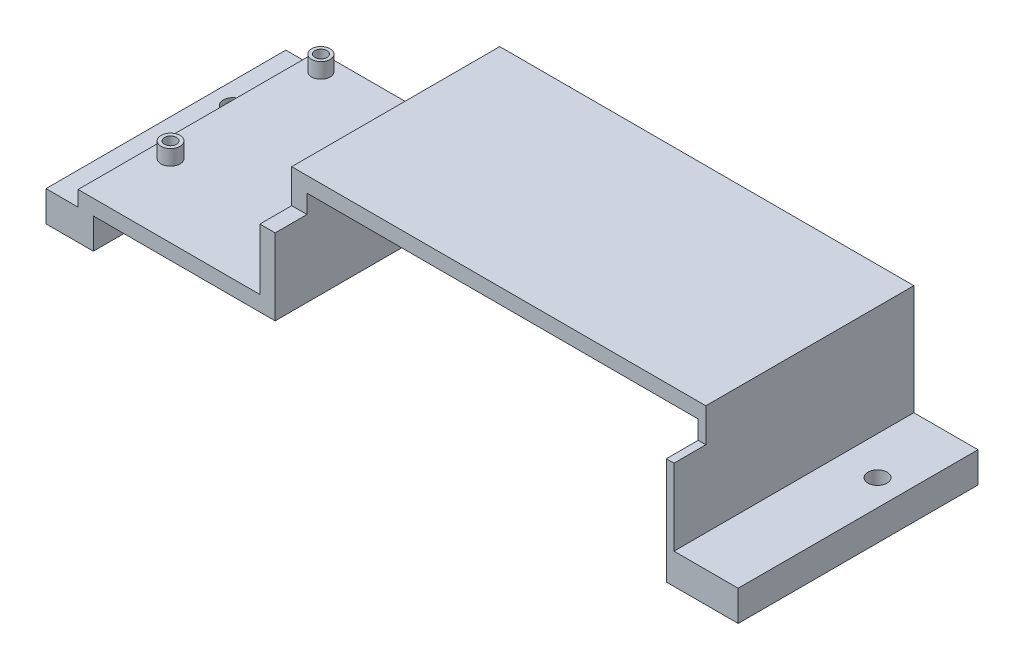
ISO-10303-21;
HEADER;
FILE_DESCRIPTION(('STEP AP214'),'2;1');
FILE_NAME('part.step','',(''),(''),'','','');
FILE_SCHEMA(('AUTOMOTIVE_DESIGN { 1 0 10303 214 1 1 1 1 }'));
ENDSEC;
DATA;
#1=APPLICATION_CONTEXT('core data for automotive mechanical design processes');
#2=APPLICATION_PROTOCOL_DEFINITION('international standard','automotive_design',2000,#1);
#3=PRODUCT_CONTEXT('',#1,'mechanical');
#4=PRODUCT('Part','Part','',(#3));
#5=PRODUCT_RELATED_PRODUCT_CATEGORY('part','',(#4));
#6=PRODUCT_DEFINITION_FORMATION('','',#4);
#7=PRODUCT_DEFINITION_CONTEXT('part definition',#1,'design');
#8=PRODUCT_DEFINITION('design','',#6,#7);
#9=PRODUCT_DEFINITION_SHAPE('','',#8);
#10=(LENGTH_UNIT() NAMED_UNIT(*) SI_UNIT(.MILLI.,.METRE.));
#11=(NAMED_UNIT(*) PLANE_ANGLE_UNIT() SI_UNIT($,.RADIAN.));
#12=(NAMED_UNIT(*) SI_UNIT($,.STERADIAN.) SOLID_ANGLE_UNIT());
#13=UNCERTAINTY_MEASURE_WITH_UNIT(LENGTH_MEASURE(1.E-05),#10,'distance_accuracy_value','');
#14=(GEOMETRIC_REPRESENTATION_CONTEXT(3) GLOBAL_UNCERTAINTY_ASSIGNED_CONTEXT((#13)) GLOBAL_UNIT_ASSIGNED_CONTEXT((#10,
#11,#12)) REPRESENTATION_CONTEXT('',''));
#15=CARTESIAN_POINT('',(0.,0.,0.));
#16=DIRECTION('',(0.,0.,1.));
#17=DIRECTION('',(1.,0.,0.));
#18=AXIS2_PLACEMENT_3D('',#15,#16,#17);
#19=CARTESIAN_POINT('',(0.,0.,39.878));
#20=DIRECTION('',(0.,0.,1.));
#21=DIRECTION('',(1.,0.,0.));
#22=AXIS2_PLACEMENT_3D('',#19,#20,#21);
#23=PLANE('',#22);
#24=DIRECTION('',(1.,0.,0.));
#25=VECTOR('',#24,1.);
#26=CARTESIAN_POINT('',(0.,12.6750852961625,39.878));
#27=LINE('',#26,#25);
#28=CARTESIAN_POINT('',(-2.54,12.6750852961625,39.878));
#29=VERTEX_POINT('',#28);
#30=CARTESIAN_POINT('',(0.,12.6750852961625,39.878));
#31=VERTEX_POINT('',#30);
#32=EDGE_CURVE('E267',#29,#31,#27,.T.);
#33=ORIENTED_EDGE('',*,*,#32,.F.);
#34=DIRECTION('',(0.,-1.,0.));
#35=VECTOR('',#34,1.);
#36=CARTESIAN_POINT('',(-2.54,2.54,39.878));
#37=LINE('',#36,#35);
#38=CARTESIAN_POINT('',(-2.54,2.54,39.878));
#39=VERTEX_POINT('',#38);
#40=EDGE_CURVE('E314',#29,#39,#37,.T.);
#41=ORIENTED_EDGE('',*,*,#40,.T.);
#42=DIRECTION('',(-1.,0.,0.));
#43=VECTOR('',#42,1.);
#44=CARTESIAN_POINT('',(-32.766,2.54,39.878));
#45=LINE('',#44,#43);
#46=CARTESIAN_POINT('',(-32.766,2.54,39.878));
#47=VERTEX_POINT('',#46);
#48=EDGE_CURVE('E310',#39,#47,#45,.T.);
#49=ORIENTED_EDGE('',*,*,#48,.T.);
#50=DIRECTION('',(0.,-1.,0.));
#51=VECTOR('',#50,1.);
#52=CARTESIAN_POINT('',(-32.766,0.,39.878));
#53=LINE('',#52,#51);
#54=CARTESIAN_POINT('',(-32.766,0.,39.878));
#55=VERTEX_POINT('',#54);
#56=EDGE_CURVE('E304',#47,#55,#53,.T.);
#57=ORIENTED_EDGE('',*,*,#56,.T.);
#58=DIRECTION('',(-1.,0.,0.));
#59=VECTOR('',#58,1.);
#60=CARTESIAN_POINT('',(-38.1,0.,39.878));
#61=LINE('',#60,#59);
#62=CARTESIAN_POINT('',(-38.1,0.,39.878));
#63=VERTEX_POINT('',#62);
#64=EDGE_CURVE('E170',#55,#63,#61,.T.);
#65=ORIENTED_EDGE('',*,*,#64,.T.);
#66=DIRECTION('',(0.,-1.,0.));
#67=VECTOR('',#66,1.);
#68=CARTESIAN_POINT('',(-38.1,-5.08,39.878));
#69=LINE('',#68,#67);
#70=CARTESIAN_POINT('',(-38.1,-5.08,39.878));
#71=VERTEX_POINT('',#70);
#72=EDGE_CURVE('E163',#63,#71,#69,.T.);
#73=ORIENTED_EDGE('',*,*,#72,.T.);
#74=DIRECTION('',(1.,0.,0.));
#75=VECTOR('',#74,1.);
#76=CARTESIAN_POINT('',(-30.226,-5.08,39.878));
#77=LINE('',#76,#75);
#78=CARTESIAN_POINT('',(-30.226,-5.08,39.878));
#79=VERTEX_POINT('',#78);
#80=EDGE_CURVE('E167',#71,#79,#77,.T.);
#81=ORIENTED_EDGE('',*,*,#80,.T.);
#82=DIRECTION('',(0.,1.,0.));
#83=VECTOR('',#82,1.);
#84=CARTESIAN_POINT('',(-30.226,0.,39.878));
#85=LINE('',#84,#83);
#86=CARTESIAN_POINT('',(-30.226,0.,39.878));
#87=VERTEX_POINT('',#86);
#88=EDGE_CURVE('E69',#79,#87,#85,.T.);
#89=ORIENTED_EDGE('',*,*,#88,.T.);
#90=DIRECTION('',(1.,0.,0.));
#91=VECTOR('',#90,1.);
#92=CARTESIAN_POINT('',(0.,0.,39.878));
#93=LINE('',#92,#91);
#94=CARTESIAN_POINT('',(0.,0.,39.878));
#95=VERTEX_POINT('',#94);
#96=EDGE_CURVE('E227',#87,#95,#93,.T.);
#97=ORIENTED_EDGE('',*,*,#96,.T.);
#98=DIRECTION('',(0.,1.,0.));
#99=VECTOR('',#98,1.);
#100=CARTESIAN_POINT('',(0.,15.748,39.878));
#101=LINE('',#100,#99);
#102=EDGE_CURVE('E135',#95,#31,#101,.T.);
#103=ORIENTED_EDGE('',*,*,#102,.T.);
#104=EDGE_LOOP('',(#33,#41,#49,#57,#65,#73,#81,#89,#97,#103));
#105=FACE_BOUND('',#104,.T.);
#106=ADVANCED_FACE('F45',(#105),#23,.T.);
#107=CARTESIAN_POINT('',(0.,0.,39.878));
#108=DIRECTION('',(0.,1.,0.));
#109=DIRECTION('',(-1.,0.,0.));
#110=AXIS2_PLACEMENT_3D('',#107,#108,#109);
#111=PLANE('',#110);
#112=DIRECTION('',(1.,0.,0.));
#113=VECTOR('',#112,1.);
#114=CARTESIAN_POINT('',(0.,0.,0.));
#115=LINE('',#114,#113);
#116=CARTESIAN_POINT('',(-30.226,0.,0.));
#117=VERTEX_POINT('',#116);
#118=CARTESIAN_POINT('',(0.,0.,0.));
#119=VERTEX_POINT('',#118);
#120=EDGE_CURVE('E191',#117,#119,#115,.T.);
#121=ORIENTED_EDGE('',*,*,#120,.T.);
#122=DIRECTION('',(0.,0.,-1.));
#123=VECTOR('',#122,1.);
#124=CARTESIAN_POINT('',(0.,0.,39.878));
#125=LINE('',#124,#123);
#126=EDGE_CURVE('E260',#95,#119,#125,.T.);
#127=ORIENTED_EDGE('',*,*,#126,.F.);
#128=ORIENTED_EDGE('',*,*,#96,.F.);
#129=DIRECTION('',(0.,0.,-1.));
#130=VECTOR('',#129,1.);
#131=CARTESIAN_POINT('',(-30.226,0.,39.878));
#132=LINE('',#131,#130);
#133=EDGE_CURVE('E187',#87,#117,#132,.T.);
#134=ORIENTED_EDGE('',*,*,#133,.T.);
#135=EDGE_LOOP('',(#121,#127,#128,#134));
#136=FACE_BOUND('',#135,.T.);
#137=ADVANCED_FACE('F47',(#136),#111,.F.);
#138=CARTESIAN_POINT('',(0.,15.748,39.878));
#139=DIRECTION('',(-1.,0.,0.));
#140=DIRECTION('',(0.,0.,1.));
#141=AXIS2_PLACEMENT_3D('',#138,#139,#140);
#142=PLANE('',#141);
#143=DIRECTION('',(0.,0.,-1.));
#144=VECTOR('',#143,1.);
#145=CARTESIAN_POINT('',(0.,15.748,39.878));
#146=LINE('',#145,#144);
#147=CARTESIAN_POINT('',(0.,15.748,34.5825851765456));
#148=VERTEX_POINT('',#147);
#149=CARTESIAN_POINT('',(0.,15.748,0.));
#150=VERTEX_POINT('',#149);
#151=EDGE_CURVE('E258',#148,#150,#146,.T.);
#152=ORIENTED_EDGE('',*,*,#151,.F.);
#153=DIRECTION('',(0.,-1.,0.));
#154=VECTOR('',#153,1.);
#155=CARTESIAN_POINT('',(0.,15.748,34.5825851765456));
#156=LINE('',#155,#154);
#157=CARTESIAN_POINT('',(0.,12.6750852961625,34.5825851765456));
#158=VERTEX_POINT('',#157);
#159=EDGE_CURVE('E335',#148,#158,#156,.T.);
#160=ORIENTED_EDGE('',*,*,#159,.T.);
#161=DIRECTION('',(0.,0.,1.));
#162=VECTOR('',#161,1.);
#163=CARTESIAN_POINT('',(0.,12.6750852961625,39.878));
#164=LINE('',#163,#162);
#165=EDGE_CURVE('E349',#158,#31,#164,.T.);
#166=ORIENTED_EDGE('',*,*,#165,.T.);
#167=ORIENTED_EDGE('',*,*,#102,.F.);
#168=ORIENTED_EDGE('',*,*,#126,.T.);
#169=DIRECTION('',(0.,1.,0.));
#170=VECTOR('',#169,1.);
#171=CARTESIAN_POINT('',(0.,15.748,0.));
#172=LINE('',#171,#170);
#173=EDGE_CURVE('E194',#119,#150,#172,.T.);
#174=ORIENTED_EDGE('',*,*,#173,.T.);
#175=EDGE_LOOP('',(#152,#160,#166,#167,#168,#174));
#176=FACE_BOUND('',#175,.T.);
#177=ADVANCED_FACE('F427',(#176),#142,.F.);
#178=CARTESIAN_POINT('',(65.040002,15.748,39.878));
#179=DIRECTION('',(0.,1.,0.));
#180=DIRECTION('',(-1.,0.,0.));
#181=AXIS2_PLACEMENT_3D('',#178,#179,#180);
#182=PLANE('',#181);
#183=DIRECTION('',(0.,0.,-1.));
#184=VECTOR('',#183,1.);
#185=CARTESIAN_POINT('',(65.040002,15.748,39.878));
#186=LINE('',#185,#184);
#187=CARTESIAN_POINT('',(65.040002,15.748,34.5825851765456));
#188=VERTEX_POINT('',#187);
#189=CARTESIAN_POINT('',(65.040002,15.748,0.));
#190=VERTEX_POINT('',#189);
#191=EDGE_CURVE('E256',#188,#190,#186,.T.);
#192=ORIENTED_EDGE('',*,*,#191,.F.);
#193=DIRECTION('',(-1.,0.,0.));
#194=VECTOR('',#193,1.);
#195=CARTESIAN_POINT('',(65.040002,15.748,34.5825851765456));
#196=LINE('',#195,#194);
#197=EDGE_CURVE('E340',#188,#148,#196,.T.);
#198=ORIENTED_EDGE('',*,*,#197,.T.);
#199=ORIENTED_EDGE('',*,*,#151,.T.);
#200=DIRECTION('',(1.,0.,0.));
#201=VECTOR('',#200,1.);
#202=CARTESIAN_POINT('',(65.040002,15.748,0.));
#203=LINE('',#202,#201);
#204=EDGE_CURVE('E198',#150,#190,#203,.T.);
#205=ORIENTED_EDGE('',*,*,#204,.T.);
#206=EDGE_LOOP('',(#192,#198,#199,#205));
#207=FACE_BOUND('',#206,.T.);
#208=ADVANCED_FACE('F490',(#207),#182,.F.);
#209=CARTESIAN_POINT('',(65.040002,-5.08,39.878));
#210=DIRECTION('',(1.,0.,0.));
#211=DIRECTION('',(0.,0.,-1.));
#212=AXIS2_PLACEMENT_3D('',#209,#210,#211);
#213=PLANE('',#212);
#214=DIRECTION('',(0.,0.,-1.));
#215=VECTOR('',#214,1.);
#216=CARTESIAN_POINT('',(65.040002,12.6750852961625,39.878));
#217=LINE('',#216,#215);
#218=CARTESIAN_POINT('',(65.040002,12.6750852961625,39.878));
#219=VERTEX_POINT('',#218);
#220=CARTESIAN_POINT('',(65.040002,12.6750852961625,34.5825851765456));
#221=VERTEX_POINT('',#220);
#222=EDGE_CURVE('E60',#219,#221,#217,.T.);
#223=ORIENTED_EDGE('',*,*,#222,.T.);
#224=DIRECTION('',(0.,1.,0.));
#225=VECTOR('',#224,1.);
#226=CARTESIAN_POINT('',(65.040002,-5.08,34.5825851765456));
#227=LINE('',#226,#225);
#228=EDGE_CURVE('E343',#221,#188,#227,.T.);
#229=ORIENTED_EDGE('',*,*,#228,.T.);
#230=ORIENTED_EDGE('',*,*,#191,.T.);
#231=DIRECTION('',(0.,-1.,0.));
#232=VECTOR('',#231,1.);
#233=CARTESIAN_POINT('',(65.040002,-5.08,0.));
#234=LINE('',#233,#232);
#235=CARTESIAN_POINT('',(65.040002,-5.08,0.));
#236=VERTEX_POINT('',#235);
#237=EDGE_CURVE('E201',#190,#236,#234,.T.);
#238=ORIENTED_EDGE('',*,*,#237,.T.);
#239=DIRECTION('',(0.,0.,-1.));
#240=VECTOR('',#239,1.);
#241=CARTESIAN_POINT('',(65.040002,-5.08,39.878));
#242=LINE('',#241,#240);
#243=CARTESIAN_POINT('',(65.040002,-5.08,39.878));
#244=VERTEX_POINT('',#243);
#245=EDGE_CURVE('E253',#244,#236,#242,.T.);
#246=ORIENTED_EDGE('',*,*,#245,.F.);
#247=DIRECTION('',(0.,-1.,0.));
#248=VECTOR('',#247,1.);
#249=CARTESIAN_POINT('',(65.040002,-5.08,39.878));
#250=LINE('',#249,#248);
#251=EDGE_CURVE('E325',#219,#244,#250,.T.);
#252=ORIENTED_EDGE('',*,*,#251,.F.);
#253=EDGE_LOOP('',(#223,#229,#230,#238,#246,#252));
#254=FACE_BOUND('',#253,.T.);
#255=ADVANCED_FACE('F448',(#254),#213,.F.);
#256=CARTESIAN_POINT('',(76.978002,-5.08,39.878));
#257=DIRECTION('',(0.,1.,0.));
#258=DIRECTION('',(-1.,0.,0.));
#259=AXIS2_PLACEMENT_3D('',#256,#257,#258);
#260=PLANE('',#259);
#261=CARTESIAN_POINT('',(72.6440000000001,-5.07999999999994,12.3690635270916));
#262=DIRECTION('',(0.,-1.,0.));
#263=DIRECTION('',(1.,0.,0.));
#264=AXIS2_PLACEMENT_3D('',#261,#262,#263);
#265=CIRCLE('',#264,1.5875);
#266=CARTESIAN_POINT('',(74.2315000000001,-5.07999999999994,12.3690635270916));
#267=VERTEX_POINT('',#266);
#268=EDGE_CURVE('E332',#267,#267,#265,.T.);
#269=ORIENTED_EDGE('',*,*,#268,.F.);
#270=EDGE_LOOP('',(#269));
#271=FACE_BOUND('',#270,.T.);
#272=DIRECTION('',(1.,0.,0.));
#273=VECTOR('',#272,1.);
#274=CARTESIAN_POINT('',(76.978002,-5.08,0.));
#275=LINE('',#274,#273);
#276=CARTESIAN_POINT('',(76.978002,-5.08,0.));
#277=VERTEX_POINT('',#276);
#278=EDGE_CURVE('E203',#236,#277,#275,.T.);
#279=ORIENTED_EDGE('',*,*,#278,.T.);
#280=DIRECTION('',(0.,0.,-1.));
#281=VECTOR('',#280,1.);
#282=CARTESIAN_POINT('',(76.978002,-5.08,39.878));
#283=LINE('',#282,#281);
#284=CARTESIAN_POINT('',(76.978002,-5.08,39.878));
#285=VERTEX_POINT('',#284);
#286=EDGE_CURVE('E250',#285,#277,#283,.T.);
#287=ORIENTED_EDGE('',*,*,#286,.F.);
#288=DIRECTION('',(1.,0.,0.));
#289=VECTOR('',#288,1.);
#290=CARTESIAN_POINT('',(76.978002,-5.08,39.878));
#291=LINE('',#290,#289);
#292=EDGE_CURVE('E323',#244,#285,#291,.T.);
#293=ORIENTED_EDGE('',*,*,#292,.F.);
#294=ORIENTED_EDGE('',*,*,#245,.T.);
#295=EDGE_LOOP('',(#279,#287,#293,#294));
#296=FACE_BOUND('',#295,.T.);
#297=ADVANCED_FACE('F455',(#271,#296),#260,.F.);
#298=CARTESIAN_POINT('',(76.978002,0.,39.878));
#299=DIRECTION('',(-1.,0.,0.));
#300=DIRECTION('',(0.,0.,1.));
#301=AXIS2_PLACEMENT_3D('',#298,#299,#300);
#302=PLANE('',#301);
#303=DIRECTION('',(0.,1.,0.));
#304=VECTOR('',#303,1.);
#305=CARTESIAN_POINT('',(76.978002,0.,0.));
#306=LINE('',#305,#304);
#307=CARTESIAN_POINT('',(76.978002,0.,0.));
#308=VERTEX_POINT('',#307);
#309=EDGE_CURVE('E205',#277,#308,#306,.T.);
#310=ORIENTED_EDGE('',*,*,#309,.T.);
#311=DIRECTION('',(0.,0.,-1.));
#312=VECTOR('',#311,1.);
#313=CARTESIAN_POINT('',(76.978002,0.,39.878));
#314=LINE('',#313,#312);
#315=CARTESIAN_POINT('',(76.978002,0.,39.878));
#316=VERTEX_POINT('',#315);
#317=EDGE_CURVE('E247',#316,#308,#314,.T.);
#318=ORIENTED_EDGE('',*,*,#317,.F.);
#319=DIRECTION('',(0.,1.,0.));
#320=VECTOR('',#319,1.);
#321=CARTESIAN_POINT('',(76.978002,0.,39.878));
#322=LINE('',#321,#320);
#323=EDGE_CURVE('E321',#285,#316,#322,.T.);
#324=ORIENTED_EDGE('',*,*,#323,.F.);
#325=ORIENTED_EDGE('',*,*,#286,.T.);
#326=EDGE_LOOP('',(#310,#318,#324,#325));
#327=FACE_BOUND('',#326,.T.);
#328=ADVANCED_FACE('F461',(#327),#302,.F.);
#329=CARTESIAN_POINT('',(66.310002,0.,39.878));
#330=DIRECTION('',(0.,-1.,0.));
#331=DIRECTION('',(0.,0.,-1.));
#332=AXIS2_PLACEMENT_3D('',#329,#330,#331);
#333=PLANE('',#332);
#334=CARTESIAN_POINT('',(72.6440000000001,0.,12.3690635270916));
#335=DIRECTION('',(0.,-1.,0.));
#336=DIRECTION('',(0.,0.,-1.));
#337=AXIS2_PLACEMENT_3D('',#334,#335,#336);
#338=CIRCLE('',#337,1.5875);
#339=CARTESIAN_POINT('',(72.6440000000001,0.,10.7815635270916));
#340=VERTEX_POINT('',#339);
#341=EDGE_CURVE('E195',#340,#340,#338,.T.);
#342=ORIENTED_EDGE('',*,*,#341,.T.);
#343=EDGE_LOOP('',(#342));
#344=FACE_BOUND('',#343,.T.);
#345=DIRECTION('',(-1.,0.,0.));
#346=VECTOR('',#345,1.);
#347=CARTESIAN_POINT('',(66.310002,0.,0.));
#348=LINE('',#347,#346);
#349=CARTESIAN_POINT('',(66.310002,0.,0.));
#350=VERTEX_POINT('',#349);
#351=EDGE_CURVE('E207',#308,#350,#348,.T.);
#352=ORIENTED_EDGE('',*,*,#351,.T.);
#353=DIRECTION('',(0.,0.,-1.));
#354=VECTOR('',#353,1.);
#355=CARTESIAN_POINT('',(66.310002,0.,39.878));
#356=LINE('',#355,#354);
#357=CARTESIAN_POINT('',(66.310002,0.,39.878));
#358=VERTEX_POINT('',#357);
#359=EDGE_CURVE('E244',#358,#350,#356,.T.);
#360=ORIENTED_EDGE('',*,*,#359,.F.);
#361=DIRECTION('',(-1.,0.,0.));
#362=VECTOR('',#361,1.);
#363=CARTESIAN_POINT('',(66.310002,0.,39.878));
#364=LINE('',#363,#362);
#365=EDGE_CURVE('E319',#316,#358,#364,.T.);
#366=ORIENTED_EDGE('',*,*,#365,.F.);
#367=ORIENTED_EDGE('',*,*,#317,.T.);
#368=EDGE_LOOP('',(#352,#360,#366,#367));
#369=FACE_BOUND('',#368,.T.);
#370=ADVANCED_FACE('F465',(#344,#369),#333,.F.);
#371=CARTESIAN_POINT('',(66.310002,18.288,39.878));
#372=DIRECTION('',(-1.,0.,0.));
#373=DIRECTION('',(0.,0.,1.));
#374=AXIS2_PLACEMENT_3D('',#371,#372,#373);
#375=PLANE('',#374);
#376=DIRECTION('',(0.,0.,-1.));
#377=VECTOR('',#376,1.);
#378=CARTESIAN_POINT('',(66.310002,18.288,39.878));
#379=LINE('',#378,#377);
#380=CARTESIAN_POINT('',(66.310002,18.288,34.5825851765456));
#381=VERTEX_POINT('',#380);
#382=CARTESIAN_POINT('',(66.310002,18.288,0.));
#383=VERTEX_POINT('',#382);
#384=EDGE_CURVE('E242',#381,#383,#379,.T.);
#385=ORIENTED_EDGE('',*,*,#384,.F.);
#386=DIRECTION('',(0.,-1.,0.));
#387=VECTOR('',#386,1.);
#388=CARTESIAN_POINT('',(66.310002,18.288,34.5825851765456));
#389=LINE('',#388,#387);
#390=CARTESIAN_POINT('',(66.310002,12.6750852961625,34.5825851765456));
#391=VERTEX_POINT('',#390);
#392=EDGE_CURVE('E346',#381,#391,#389,.T.);
#393=ORIENTED_EDGE('',*,*,#392,.T.);
#394=DIRECTION('',(0.,0.,1.));
#395=VECTOR('',#394,1.);
#396=CARTESIAN_POINT('',(66.310002,12.6750852961625,39.878));
#397=LINE('',#396,#395);
#398=CARTESIAN_POINT('',(66.310002,12.6750852961625,39.878));
#399=VERTEX_POINT('',#398);
#400=EDGE_CURVE('E352',#391,#399,#397,.T.);
#401=ORIENTED_EDGE('',*,*,#400,.T.);
#402=DIRECTION('',(0.,1.,0.));
#403=VECTOR('',#402,1.);
#404=CARTESIAN_POINT('',(66.310002,18.288,39.878));
#405=LINE('',#404,#403);
#406=EDGE_CURVE('E316',#358,#399,#405,.T.);
#407=ORIENTED_EDGE('',*,*,#406,.F.);
#408=ORIENTED_EDGE('',*,*,#359,.T.);
#409=DIRECTION('',(0.,1.,0.));
#410=VECTOR('',#409,1.);
#411=CARTESIAN_POINT('',(66.310002,18.288,0.));
#412=LINE('',#411,#410);
#413=EDGE_CURVE('E209',#350,#383,#412,.T.);
#414=ORIENTED_EDGE('',*,*,#413,.T.);
#415=EDGE_LOOP('',(#385,#393,#401,#407,#408,#414));
#416=FACE_BOUND('',#415,.T.);
#417=ADVANCED_FACE('F469',(#416),#375,.F.);
#418=CARTESIAN_POINT('',(-2.54,18.288,39.878));
#419=DIRECTION('',(0.,-1.,0.));
#420=DIRECTION('',(0.,0.,-1.));
#421=AXIS2_PLACEMENT_3D('',#418,#419,#420);
#422=PLANE('',#421);
#423=DIRECTION('',(0.,0.,-1.));
#424=VECTOR('',#423,1.);
#425=CARTESIAN_POINT('',(-2.54,18.288,39.878));
#426=LINE('',#425,#424);
#427=CARTESIAN_POINT('',(-2.54,18.288,34.5825851765456));
#428=VERTEX_POINT('',#427);
#429=CARTESIAN_POINT('',(-2.54,18.288,0.));
#430=VERTEX_POINT('',#429);
#431=EDGE_CURVE('E240',#428,#430,#426,.T.);
#432=ORIENTED_EDGE('',*,*,#431,.F.);
#433=DIRECTION('',(1.,0.,0.));
#434=VECTOR('',#433,1.);
#435=CARTESIAN_POINT('',(-38.1,18.288,34.5825851765456));
#436=LINE('',#435,#434);
#437=EDGE_CURVE('E358',#428,#381,#436,.T.);
#438=ORIENTED_EDGE('',*,*,#437,.T.);
#439=ORIENTED_EDGE('',*,*,#384,.T.);
#440=DIRECTION('',(-1.,0.,0.));
#441=VECTOR('',#440,1.);
#442=CARTESIAN_POINT('',(-2.54,18.288,0.));
#443=LINE('',#442,#441);
#444=EDGE_CURVE('E212',#383,#430,#443,.T.);
#445=ORIENTED_EDGE('',*,*,#444,.T.);
#446=EDGE_LOOP('',(#432,#438,#439,#445));
#447=FACE_BOUND('',#446,.T.);
#448=ADVANCED_FACE('F497',(#447),#422,.F.);
#449=CARTESIAN_POINT('',(-2.54,2.54,39.878));
#450=DIRECTION('',(1.,0.,0.));
#451=DIRECTION('',(0.,1.,0.));
#452=AXIS2_PLACEMENT_3D('',#449,#450,#451);
#453=PLANE('',#452);
#454=DIRECTION('',(0.,0.,-1.));
#455=VECTOR('',#454,1.);
#456=CARTESIAN_POINT('',(-2.54,12.6750852961625,39.878));
#457=LINE('',#456,#455);
#458=CARTESIAN_POINT('',(-2.54,12.6750852961625,34.5825851765456));
#459=VERTEX_POINT('',#458);
#460=EDGE_CURVE('E355',#29,#459,#457,.T.);
#461=ORIENTED_EDGE('',*,*,#460,.T.);
#462=DIRECTION('',(0.,1.,0.));
#463=VECTOR('',#462,1.);
#464=CARTESIAN_POINT('',(-2.54,2.54,34.5825851765456));
#465=LINE('',#464,#463);
#466=EDGE_CURVE('E268',#459,#428,#465,.T.);
#467=ORIENTED_EDGE('',*,*,#466,.T.);
#468=ORIENTED_EDGE('',*,*,#431,.T.);
#469=DIRECTION('',(0.,-1.,0.));
#470=VECTOR('',#469,1.);
#471=CARTESIAN_POINT('',(-2.54,2.54,0.));
#472=LINE('',#471,#470);
#473=CARTESIAN_POINT('',(-2.54,2.54,0.));
#474=VERTEX_POINT('',#473);
#475=EDGE_CURVE('E215',#430,#474,#472,.T.);
#476=ORIENTED_EDGE('',*,*,#475,.T.);
#477=DIRECTION('',(0.,0.,-1.));
#478=VECTOR('',#477,1.);
#479=CARTESIAN_POINT('',(-2.54,2.54,39.878));
#480=LINE('',#479,#478);
#481=EDGE_CURVE('E237',#39,#474,#480,.T.);
#482=ORIENTED_EDGE('',*,*,#481,.F.);
#483=ORIENTED_EDGE('',*,*,#40,.F.);
#484=EDGE_LOOP('',(#461,#467,#468,#476,#482,#483));
#485=FACE_BOUND('',#484,.T.);
#486=ADVANCED_FACE('F285',(#485),#453,.F.);
#487=CARTESIAN_POINT('',(-32.766,2.54,39.878));
#488=DIRECTION('',(0.,-1.,0.));
#489=DIRECTION('',(1.,0.,0.));
#490=AXIS2_PLACEMENT_3D('',#487,#488,#489);
#491=PLANE('',#490);
#492=CARTESIAN_POINT('',(-29.5399999999999,2.54,2.73004556014657));
#493=DIRECTION('',(0.,-1.,0.));
#494=DIRECTION('',(1.,0.,0.));
#495=AXIS2_PLACEMENT_3D('',#492,#493,#494);
#496=CIRCLE('',#495,1.53694672270215);
#497=CARTESIAN_POINT('',(-28.0030532772978,2.54,2.73004556014657));
#498=VERTEX_POINT('',#497);
#499=EDGE_CURVE('E11',#498,#498,#496,.F.);
#500=ORIENTED_EDGE('',*,*,#499,.F.);
#501=EDGE_LOOP('',(#500));
#502=FACE_BOUND('',#501,.T.);
#503=CARTESIAN_POINT('',(-4.5399999999999,2.54,27.7300455601466));
#504=DIRECTION('',(0.,-1.,0.));
#505=DIRECTION('',(1.,0.,0.));
#506=AXIS2_PLACEMENT_3D('',#503,#504,#505);
#507=CIRCLE('',#506,1.57459899240842);
#508=CARTESIAN_POINT('',(-2.96540100759147,2.54,27.7300455601466));
#509=VERTEX_POINT('',#508);
#510=EDGE_CURVE('E53',#509,#509,#507,.F.);
#511=ORIENTED_EDGE('',*,*,#510,.F.);
#512=EDGE_LOOP('',(#511));
#513=FACE_BOUND('',#512,.T.);
#514=CARTESIAN_POINT('',(-4.5399999999999,2.54,2.73004556014657));
#515=DIRECTION('',(0.,-1.,0.));
#516=DIRECTION('',(1.,0.,0.));
#517=AXIS2_PLACEMENT_3D('',#514,#515,#516);
#518=CIRCLE('',#517,1.62693178354419);
#519=CARTESIAN_POINT('',(-2.9130682164557,2.54,2.73004556014657));
#520=VERTEX_POINT('',#519);
#521=EDGE_CURVE('E274',#520,#520,#518,.F.);
#522=ORIENTED_EDGE('',*,*,#521,.F.);
#523=EDGE_LOOP('',(#522));
#524=FACE_BOUND('',#523,.T.);
#525=CARTESIAN_POINT('',(-29.5399999999999,2.54,27.7300455601466));
#526=DIRECTION('',(0.,-1.,0.));
#527=DIRECTION('',(1.,0.,0.));
#528=AXIS2_PLACEMENT_3D('',#525,#526,#527);
#529=CIRCLE('',#528,1.57675779448851);
#530=CARTESIAN_POINT('',(-27.9632422055114,2.54,27.7300455601466));
#531=VERTEX_POINT('',#530);
#532=EDGE_CURVE('E271',#531,#531,#529,.F.);
#533=ORIENTED_EDGE('',*,*,#532,.F.);
#534=EDGE_LOOP('',(#533));
#535=FACE_BOUND('',#534,.T.);
#536=DIRECTION('',(-1.,0.,0.));
#537=VECTOR('',#536,1.);
#538=CARTESIAN_POINT('',(-32.766,2.54,0.));
#539=LINE('',#538,#537);
#540=CARTESIAN_POINT('',(-32.766,2.54,0.));
#541=VERTEX_POINT('',#540);
#542=EDGE_CURVE('E217',#474,#541,#539,.T.);
#543=ORIENTED_EDGE('',*,*,#542,.T.);
#544=DIRECTION('',(0.,0.,-1.));
#545=VECTOR('',#544,1.);
#546=CARTESIAN_POINT('',(-32.766,2.54,39.878));
#547=LINE('',#546,#545);
#548=EDGE_CURVE('E234',#47,#541,#547,.T.);
#549=ORIENTED_EDGE('',*,*,#548,.F.);
#550=ORIENTED_EDGE('',*,*,#48,.F.);
#551=ORIENTED_EDGE('',*,*,#481,.T.);
#552=EDGE_LOOP('',(#543,#549,#550,#551));
#553=FACE_BOUND('',#552,.T.);
#554=ADVANCED_FACE('F281',(#502,#513,#524,#535,#553),#491,.F.);
#555=CARTESIAN_POINT('',(-32.766,0.,39.878));
#556=DIRECTION('',(1.,0.,0.));
#557=DIRECTION('',(0.,0.,-1.));
#558=AXIS2_PLACEMENT_3D('',#555,#556,#557);
#559=PLANE('',#558);
#560=DIRECTION('',(0.,-1.,0.));
#561=VECTOR('',#560,1.);
#562=CARTESIAN_POINT('',(-32.766,0.,0.));
#563=LINE('',#562,#561);
#564=CARTESIAN_POINT('',(-32.766,0.,0.));
#565=VERTEX_POINT('',#564);
#566=EDGE_CURVE('E219',#541,#565,#563,.T.);
#567=ORIENTED_EDGE('',*,*,#566,.T.);
#568=DIRECTION('',(0.,0.,-1.));
#569=VECTOR('',#568,1.);
#570=CARTESIAN_POINT('',(-32.766,0.,39.878));
#571=LINE('',#570,#569);
#572=EDGE_CURVE('E231',#55,#565,#571,.T.);
#573=ORIENTED_EDGE('',*,*,#572,.F.);
#574=ORIENTED_EDGE('',*,*,#56,.F.);
#575=ORIENTED_EDGE('',*,*,#548,.T.);
#576=EDGE_LOOP('',(#567,#573,#574,#575));
#577=FACE_BOUND('',#576,.T.);
#578=ADVANCED_FACE('F284',(#577),#559,.F.);
#579=CARTESIAN_POINT('',(-38.1,0.,39.878));
#580=DIRECTION('',(0.,-1.,0.));
#581=DIRECTION('',(0.,0.,-1.));
#582=AXIS2_PLACEMENT_3D('',#579,#580,#581);
#583=PLANE('',#582);
#584=CARTESIAN_POINT('',(-34.544,0.,12.3690635270917));
#585=DIRECTION('',(0.,-1.,0.));
#586=DIRECTION('',(0.,0.,-1.));
#587=AXIS2_PLACEMENT_3D('',#584,#585,#586);
#588=CIRCLE('',#587,1.58750000000001);
#589=CARTESIAN_POINT('',(-34.544,0.,10.7815635270917));
#590=VERTEX_POINT('',#589);
#591=EDGE_CURVE('E265',#590,#590,#588,.T.);
#592=ORIENTED_EDGE('',*,*,#591,.T.);
#593=EDGE_LOOP('',(#592));
#594=FACE_BOUND('',#593,.T.);
#595=DIRECTION('',(-1.,0.,0.));
#596=VECTOR('',#595,1.);
#597=CARTESIAN_POINT('',(-38.1,0.,0.));
#598=LINE('',#597,#596);
#599=CARTESIAN_POINT('',(-38.1,0.,0.));
#600=VERTEX_POINT('',#599);
#601=EDGE_CURVE('E221',#565,#600,#598,.T.);
#602=ORIENTED_EDGE('',*,*,#601,.T.);
#603=DIRECTION('',(0.,0.,-1.));
#604=VECTOR('',#603,1.);
#605=CARTESIAN_POINT('',(-38.1,0.,39.878));
#606=LINE('',#605,#604);
#607=EDGE_CURVE('E182',#63,#600,#606,.T.);
#608=ORIENTED_EDGE('',*,*,#607,.F.);
#609=ORIENTED_EDGE('',*,*,#64,.F.);
#610=ORIENTED_EDGE('',*,*,#572,.T.);
#611=EDGE_LOOP('',(#602,#608,#609,#610));
#612=FACE_BOUND('',#611,.T.);
#613=ADVANCED_FACE('F309',(#594,#612),#583,.F.);
#614=CARTESIAN_POINT('',(-38.1,-5.08,39.878));
#615=DIRECTION('',(1.,0.,0.));
#616=DIRECTION('',(0.,0.,-1.));
#617=AXIS2_PLACEMENT_3D('',#614,#615,#616);
#618=PLANE('',#617);
#619=DIRECTION('',(0.,-1.,0.));
#620=VECTOR('',#619,1.);
#621=CARTESIAN_POINT('',(-38.1,-5.08,0.));
#622=LINE('',#621,#620);
#623=CARTESIAN_POINT('',(-38.1,-5.08,0.));
#624=VERTEX_POINT('',#623);
#625=EDGE_CURVE('E179',#600,#624,#622,.T.);
#626=ORIENTED_EDGE('',*,*,#625,.T.);
#627=DIRECTION('',(0.,0.,-1.));
#628=VECTOR('',#627,1.);
#629=CARTESIAN_POINT('',(-38.1,-5.08,39.878));
#630=LINE('',#629,#628);
#631=EDGE_CURVE('E176',#71,#624,#630,.T.);
#632=ORIENTED_EDGE('',*,*,#631,.F.);
#633=ORIENTED_EDGE('',*,*,#72,.F.);
#634=ORIENTED_EDGE('',*,*,#607,.T.);
#635=EDGE_LOOP('',(#626,#632,#633,#634));
#636=FACE_BOUND('',#635,.T.);
#637=ADVANCED_FACE('F177',(#636),#618,.F.);
#638=CARTESIAN_POINT('',(-30.226,-5.08,39.878));
#639=DIRECTION('',(0.,1.,0.));
#640=DIRECTION('',(-1.,0.,0.));
#641=AXIS2_PLACEMENT_3D('',#638,#639,#640);
#642=PLANE('',#641);
#643=CARTESIAN_POINT('',(-34.544,-5.08,12.3690635270917));
#644=DIRECTION('',(0.,-1.,0.));
#645=DIRECTION('',(1.,0.,0.));
#646=AXIS2_PLACEMENT_3D('',#643,#644,#645);
#647=CIRCLE('',#646,1.58750000000001);
#648=CARTESIAN_POINT('',(-32.9565,-5.08,12.3690635270917));
#649=VERTEX_POINT('',#648);
#650=EDGE_CURVE('E331',#649,#649,#647,.T.);
#651=ORIENTED_EDGE('',*,*,#650,.F.);
#652=EDGE_LOOP('',(#651));
#653=FACE_BOUND('',#652,.T.);
#654=DIRECTION('',(1.,0.,0.));
#655=VECTOR('',#654,1.);
#656=CARTESIAN_POINT('',(-30.226,-5.08,0.));
#657=LINE('',#656,#655);
#658=CARTESIAN_POINT('',(-30.226,-5.08,0.));
#659=VERTEX_POINT('',#658);
#660=EDGE_CURVE('E224',#624,#659,#657,.T.);
#661=ORIENTED_EDGE('',*,*,#660,.T.);
#662=DIRECTION('',(0.,0.,-1.));
#663=VECTOR('',#662,1.);
#664=CARTESIAN_POINT('',(-30.226,-5.08,39.878));
#665=LINE('',#664,#663);
#666=EDGE_CURVE('E183',#79,#659,#665,.T.);
#667=ORIENTED_EDGE('',*,*,#666,.F.);
#668=ORIENTED_EDGE('',*,*,#80,.F.);
#669=ORIENTED_EDGE('',*,*,#631,.T.);
#670=EDGE_LOOP('',(#661,#667,#668,#669));
#671=FACE_BOUND('',#670,.T.);
#672=ADVANCED_FACE('F185',(#653,#671),#642,.F.);
#673=CARTESIAN_POINT('',(-30.226,0.,39.878));
#674=DIRECTION('',(-1.,0.,0.));
#675=DIRECTION('',(0.,-1.,0.));
#676=AXIS2_PLACEMENT_3D('',#673,#674,#675);
#677=PLANE('',#676);
#678=DIRECTION('',(0.,1.,0.));
#679=VECTOR('',#678,1.);
#680=CARTESIAN_POINT('',(-30.226,0.,0.));
#681=LINE('',#680,#679);
#682=EDGE_CURVE('E126',#659,#117,#681,.T.);
#683=ORIENTED_EDGE('',*,*,#682,.T.);
#684=ORIENTED_EDGE('',*,*,#133,.F.);
#685=ORIENTED_EDGE('',*,*,#88,.F.);
#686=ORIENTED_EDGE('',*,*,#666,.T.);
#687=EDGE_LOOP('',(#683,#684,#685,#686));
#688=FACE_BOUND('',#687,.T.);
#689=ADVANCED_FACE('F432',(#688),#677,.F.);
#690=EDGE_CURVE('E262',#219,#399,#27,.T.);
#691=ORIENTED_EDGE('',*,*,#690,.F.);
#692=ORIENTED_EDGE('',*,*,#251,.T.);
#693=ORIENTED_EDGE('',*,*,#292,.T.);
#694=ORIENTED_EDGE('',*,*,#323,.T.);
#695=ORIENTED_EDGE('',*,*,#365,.T.);
#696=ORIENTED_EDGE('',*,*,#406,.T.);
#697=EDGE_LOOP('',(#691,#692,#693,#694,#695,#696));
#698=FACE_BOUND('',#697,.T.);
#699=ADVANCED_FACE('F421',(#698),#23,.T.);
#700=CARTESIAN_POINT('',(0.,0.,0.));
#701=DIRECTION('',(0.,0.,1.));
#702=DIRECTION('',(1.,0.,0.));
#703=AXIS2_PLACEMENT_3D('',#700,#701,#702);
#704=PLANE('',#703);
#705=ORIENTED_EDGE('',*,*,#120,.F.);
#706=ORIENTED_EDGE('',*,*,#682,.F.);
#707=ORIENTED_EDGE('',*,*,#660,.F.);
#708=ORIENTED_EDGE('',*,*,#625,.F.);
#709=ORIENTED_EDGE('',*,*,#601,.F.);
#710=ORIENTED_EDGE('',*,*,#566,.F.);
#711=ORIENTED_EDGE('',*,*,#542,.F.);
#712=ORIENTED_EDGE('',*,*,#475,.F.);
#713=ORIENTED_EDGE('',*,*,#444,.F.);
#714=ORIENTED_EDGE('',*,*,#413,.F.);
#715=ORIENTED_EDGE('',*,*,#351,.F.);
#716=ORIENTED_EDGE('',*,*,#309,.F.);
#717=ORIENTED_EDGE('',*,*,#278,.F.);
#718=ORIENTED_EDGE('',*,*,#237,.F.);
#719=ORIENTED_EDGE('',*,*,#204,.F.);
#720=ORIENTED_EDGE('',*,*,#173,.F.);
#721=EDGE_LOOP('',(#705,#706,#707,#708,#709,#710,#711,#712,#713,#714,#715,#716,#717,#718,#719,#720));
#722=FACE_BOUND('',#721,.T.);
#723=ADVANCED_FACE('F307',(#722),#704,.F.);
#724=CARTESIAN_POINT('',(-34.544,18.288,12.3690635270917));
#725=DIRECTION('',(0.,-1.,0.));
#726=DIRECTION('',(1.,0.,0.));
#727=AXIS2_PLACEMENT_3D('',#724,#725,#726);
#728=CYLINDRICAL_SURFACE('',#727,1.58750000000001);
#729=ORIENTED_EDGE('',*,*,#650,.T.);
#730=EDGE_LOOP('',(#729));
#731=FACE_BOUND('',#730,.T.);
#732=ORIENTED_EDGE('',*,*,#591,.F.);
#733=EDGE_LOOP('',(#732));
#734=FACE_BOUND('',#733,.T.);
#735=ADVANCED_FACE('F439',(#731,#734),#728,.F.);
#736=CARTESIAN_POINT('',(72.644,18.2880000000001,12.3690635270916));
#737=DIRECTION('',(0.,-1.,0.));
#738=DIRECTION('',(1.,0.,0.));
#739=AXIS2_PLACEMENT_3D('',#736,#737,#738);
#740=CYLINDRICAL_SURFACE('',#739,1.5875);
#741=ORIENTED_EDGE('',*,*,#268,.T.);
#742=EDGE_LOOP('',(#741));
#743=FACE_BOUND('',#742,.T.);
#744=ORIENTED_EDGE('',*,*,#341,.F.);
#745=EDGE_LOOP('',(#744));
#746=FACE_BOUND('',#745,.T.);
#747=ADVANCED_FACE('F551',(#743,#746),#740,.F.);
#748=CARTESIAN_POINT('',(-38.1,18.288,34.5825851765456));
#749=DIRECTION('',(0.,0.,-1.));
#750=DIRECTION('',(-1.,0.,0.));
#751=AXIS2_PLACEMENT_3D('',#748,#749,#750);
#752=PLANE('',#751);
#753=ORIENTED_EDGE('',*,*,#197,.F.);
#754=ORIENTED_EDGE('',*,*,#228,.F.);
#755=DIRECTION('',(1.,0.,0.));
#756=VECTOR('',#755,1.);
#757=CARTESIAN_POINT('',(-38.1,12.6750852961625,34.5825851765456));
#758=LINE('',#757,#756);
#759=EDGE_CURVE('E359',#221,#391,#758,.T.);
#760=ORIENTED_EDGE('',*,*,#759,.T.);
#761=ORIENTED_EDGE('',*,*,#392,.F.);
#762=ORIENTED_EDGE('',*,*,#437,.F.);
#763=ORIENTED_EDGE('',*,*,#466,.F.);
#764=EDGE_CURVE('E362',#459,#158,#758,.T.);
#765=ORIENTED_EDGE('',*,*,#764,.T.);
#766=ORIENTED_EDGE('',*,*,#159,.F.);
#767=EDGE_LOOP('',(#753,#754,#760,#761,#762,#763,#765,#766));
#768=FACE_BOUND('',#767,.T.);
#769=ADVANCED_FACE('F481',(#768),#752,.F.);
#770=CARTESIAN_POINT('',(-38.1,12.6750852961625,39.878));
#771=DIRECTION('',(0.,-1.,0.));
#772=DIRECTION('',(0.,0.,-1.));
#773=AXIS2_PLACEMENT_3D('',#770,#771,#772);
#774=PLANE('',#773);
#775=ORIENTED_EDGE('',*,*,#764,.F.);
#776=ORIENTED_EDGE('',*,*,#460,.F.);
#777=ORIENTED_EDGE('',*,*,#32,.T.);
#778=ORIENTED_EDGE('',*,*,#165,.F.);
#779=EDGE_LOOP('',(#775,#776,#777,#778));
#780=FACE_BOUND('',#779,.T.);
#781=ADVANCED_FACE('F509',(#780),#774,.F.);
#782=ORIENTED_EDGE('',*,*,#690,.T.);
#783=ORIENTED_EDGE('',*,*,#400,.F.);
#784=ORIENTED_EDGE('',*,*,#759,.F.);
#785=ORIENTED_EDGE('',*,*,#222,.F.);
#786=EDGE_LOOP('',(#782,#783,#784,#785));
#787=FACE_BOUND('',#786,.T.);
#788=ADVANCED_FACE('F475',(#787),#774,.F.);
#789=CARTESIAN_POINT('',(-29.5399999999999,5.08,27.7300455601466));
#790=DIRECTION('',(0.,1.,0.));
#791=DIRECTION('',(-1.,0.,0.));
#792=AXIS2_PLACEMENT_3D('',#789,#790,#791);
#793=PLANE('',#792);
#794=CARTESIAN_POINT('',(-29.5399999999999,5.08,27.7300455601466));
#795=DIRECTION('',(0.,1.,0.));
#796=DIRECTION('',(-1.,0.,0.));
#797=AXIS2_PLACEMENT_3D('',#794,#795,#796);
#798=CIRCLE('',#797,1.57675779448851);
#799=CARTESIAN_POINT('',(-31.1167577944884,5.08,27.7300455601466));
#800=VERTEX_POINT('',#799);
#801=EDGE_CURVE('E363',#800,#800,#798,.T.);
#802=ORIENTED_EDGE('',*,*,#801,.T.);
#803=EDGE_LOOP('',(#802));
#804=FACE_BOUND('',#803,.T.);
#805=CARTESIAN_POINT('',(-29.5399999999999,5.08,27.7300455601466));
#806=DIRECTION('',(0.,1.,0.));
#807=DIRECTION('',(-1.,0.,0.));
#808=AXIS2_PLACEMENT_3D('',#805,#806,#807);
#809=CIRCLE('',#808,1.);
#810=CARTESIAN_POINT('',(-30.5399999999999,5.08,27.7300455601466));
#811=VERTEX_POINT('',#810);
#812=EDGE_CURVE('E368',#811,#811,#809,.T.);
#813=ORIENTED_EDGE('',*,*,#812,.F.);
#814=EDGE_LOOP('',(#813));
#815=FACE_BOUND('',#814,.T.);
#816=ADVANCED_FACE('F564',(#804,#815),#793,.T.);
#817=CARTESIAN_POINT('',(-29.5399999999999,5.08,27.7300455601466));
#818=DIRECTION('',(0.,-1.,0.));
#819=DIRECTION('',(1.,0.,0.));
#820=AXIS2_PLACEMENT_3D('',#817,#818,#819);
#821=CYLINDRICAL_SURFACE('',#820,1.57675779448851);
#822=ORIENTED_EDGE('',*,*,#801,.F.);
#823=EDGE_LOOP('',(#822));
#824=FACE_BOUND('',#823,.T.);
#825=ORIENTED_EDGE('',*,*,#532,.T.);
#826=EDGE_LOOP('',(#825));
#827=FACE_BOUND('',#826,.T.);
#828=ADVANCED_FACE('F561',(#824,#827),#821,.T.);
#829=CARTESIAN_POINT('',(-29.5399999999999,5.08,27.7300455601466));
#830=DIRECTION('',(0.,-1.,0.));
#831=DIRECTION('',(1.,0.,0.));
#832=AXIS2_PLACEMENT_3D('',#829,#830,#831);
#833=CYLINDRICAL_SURFACE('',#832,1.);
#834=ORIENTED_EDGE('',*,*,#812,.T.);
#835=EDGE_LOOP('',(#834));
#836=FACE_BOUND('',#835,.T.);
#837=CARTESIAN_POINT('',(-29.5399999999999,2.54,27.7300455601466));
#838=DIRECTION('',(0.,1.,0.));
#839=DIRECTION('',(-1.,0.,0.));
#840=AXIS2_PLACEMENT_3D('',#837,#838,#839);
#841=CIRCLE('',#840,1.);
#842=CARTESIAN_POINT('',(-30.5399999999999,2.54,27.7300455601466));
#843=VERTEX_POINT('',#842);
#844=EDGE_CURVE('E369',#843,#843,#841,.T.);
#845=ORIENTED_EDGE('',*,*,#844,.F.);
#846=EDGE_LOOP('',(#845));
#847=FACE_BOUND('',#846,.T.);
#848=ADVANCED_FACE('F417',(#836,#847),#833,.F.);
#849=CARTESIAN_POINT('',(-4.5399999999999,5.08,2.73004556014657));
#850=DIRECTION('',(0.,1.,0.));
#851=DIRECTION('',(-1.,0.,0.));
#852=AXIS2_PLACEMENT_3D('',#849,#850,#851);
#853=PLANE('',#852);
#854=CARTESIAN_POINT('',(-4.5399999999999,5.08,2.73004556014657));
#855=DIRECTION('',(0.,1.,0.));
#856=DIRECTION('',(-1.,0.,0.));
#857=AXIS2_PLACEMENT_3D('',#854,#855,#856);
#858=CIRCLE('',#857,1.62693178354419);
#859=CARTESIAN_POINT('',(-6.16693178354409,5.08,2.73004556014657));
#860=VERTEX_POINT('',#859);
#861=EDGE_CURVE('E396',#860,#860,#858,.T.);
#862=ORIENTED_EDGE('',*,*,#861,.T.);
#863=EDGE_LOOP('',(#862));
#864=FACE_BOUND('',#863,.T.);
#865=CARTESIAN_POINT('',(-4.5399999999999,5.08,2.73004556014657));
#866=DIRECTION('',(0.,1.,0.));
#867=DIRECTION('',(-1.,0.,0.));
#868=AXIS2_PLACEMENT_3D('',#865,#866,#867);
#869=CIRCLE('',#868,1.);
#870=CARTESIAN_POINT('',(-5.5399999999999,5.08,2.73004556014657));
#871=VERTEX_POINT('',#870);
#872=EDGE_CURVE('E393',#871,#871,#869,.T.);
#873=ORIENTED_EDGE('',*,*,#872,.F.);
#874=EDGE_LOOP('',(#873));
#875=FACE_BOUND('',#874,.T.);
#876=ADVANCED_FACE('F402',(#864,#875),#853,.T.);
#877=CARTESIAN_POINT('',(-4.5399999999999,5.08,2.73004556014657));
#878=DIRECTION('',(0.,-1.,0.));
#879=DIRECTION('',(1.,0.,0.));
#880=AXIS2_PLACEMENT_3D('',#877,#878,#879);
#881=CYLINDRICAL_SURFACE('',#880,1.62693178354419);
#882=ORIENTED_EDGE('',*,*,#861,.F.);
#883=EDGE_LOOP('',(#882));
#884=FACE_BOUND('',#883,.T.);
#885=ORIENTED_EDGE('',*,*,#521,.T.);
#886=EDGE_LOOP('',(#885));
#887=FACE_BOUND('',#886,.T.);
#888=ADVANCED_FACE('F405',(#884,#887),#881,.T.);
#889=CARTESIAN_POINT('',(-4.5399999999999,5.08,2.73004556014657));
#890=DIRECTION('',(0.,-1.,0.));
#891=DIRECTION('',(1.,0.,0.));
#892=AXIS2_PLACEMENT_3D('',#889,#890,#891);
#893=CYLINDRICAL_SURFACE('',#892,1.);
#894=ORIENTED_EDGE('',*,*,#872,.T.);
#895=EDGE_LOOP('',(#894));
#896=FACE_BOUND('',#895,.T.);
#897=CARTESIAN_POINT('',(-4.5399999999999,2.54,2.73004556014657));
#898=DIRECTION('',(0.,1.,0.));
#899=DIRECTION('',(-1.,0.,0.));
#900=AXIS2_PLACEMENT_3D('',#897,#898,#899);
#901=CIRCLE('',#900,1.);
#902=CARTESIAN_POINT('',(-5.5399999999999,2.54,2.73004556014657));
#903=VERTEX_POINT('',#902);
#904=EDGE_CURVE('E385',#903,#903,#901,.T.);
#905=ORIENTED_EDGE('',*,*,#904,.F.);
#906=EDGE_LOOP('',(#905));
#907=FACE_BOUND('',#906,.T.);
#908=ADVANCED_FACE('F408',(#896,#907),#893,.F.);
#909=CARTESIAN_POINT('',(-4.5399999999999,5.08,27.7300455601466));
#910=DIRECTION('',(0.,1.,0.));
#911=DIRECTION('',(-1.,0.,0.));
#912=AXIS2_PLACEMENT_3D('',#909,#910,#911);
#913=PLANE('',#912);
#914=CARTESIAN_POINT('',(-4.5399999999999,5.08,27.7300455601466));
#915=DIRECTION('',(0.,1.,0.));
#916=DIRECTION('',(-1.,0.,0.));
#917=AXIS2_PLACEMENT_3D('',#914,#915,#916);
#918=CIRCLE('',#917,1.57459899240842);
#919=CARTESIAN_POINT('',(-6.11459899240831,5.08,27.7300455601466));
#920=VERTEX_POINT('',#919);
#921=EDGE_CURVE('E379',#920,#920,#918,.T.);
#922=ORIENTED_EDGE('',*,*,#921,.T.);
#923=EDGE_LOOP('',(#922));
#924=FACE_BOUND('',#923,.T.);
#925=CARTESIAN_POINT('',(-4.5399999999999,5.08,27.7300455601466));
#926=DIRECTION('',(0.,1.,0.));
#927=DIRECTION('',(-1.,0.,0.));
#928=AXIS2_PLACEMENT_3D('',#925,#926,#927);
#929=CIRCLE('',#928,1.);
#930=CARTESIAN_POINT('',(-5.5399999999999,5.08,27.7300455601466));
#931=VERTEX_POINT('',#930);
#932=EDGE_CURVE('E375',#931,#931,#929,.T.);
#933=ORIENTED_EDGE('',*,*,#932,.F.);
#934=EDGE_LOOP('',(#933));
#935=FACE_BOUND('',#934,.T.);
#936=ADVANCED_FACE('F414',(#924,#935),#913,.T.);
#937=CARTESIAN_POINT('',(-4.5399999999999,5.08,27.7300455601466));
#938=DIRECTION('',(0.,-1.,0.));
#939=DIRECTION('',(1.,0.,0.));
#940=AXIS2_PLACEMENT_3D('',#937,#938,#939);
#941=CYLINDRICAL_SURFACE('',#940,1.57459899240842);
#942=ORIENTED_EDGE('',*,*,#921,.F.);
#943=EDGE_LOOP('',(#942));
#944=FACE_BOUND('',#943,.T.);
#945=ORIENTED_EDGE('',*,*,#510,.T.);
#946=EDGE_LOOP('',(#945));
#947=FACE_BOUND('',#946,.T.);
#948=ADVANCED_FACE('F279',(#944,#947),#941,.T.);
#949=CARTESIAN_POINT('',(-4.5399999999999,5.08,27.7300455601466));
#950=DIRECTION('',(0.,-1.,0.));
#951=DIRECTION('',(1.,0.,0.));
#952=AXIS2_PLACEMENT_3D('',#949,#950,#951);
#953=CYLINDRICAL_SURFACE('',#952,1.);
#954=ORIENTED_EDGE('',*,*,#932,.T.);
#955=EDGE_LOOP('',(#954));
#956=FACE_BOUND('',#955,.T.);
#957=CARTESIAN_POINT('',(-4.5399999999999,2.54,27.7300455601466));
#958=DIRECTION('',(0.,1.,0.));
#959=DIRECTION('',(-1.,0.,0.));
#960=AXIS2_PLACEMENT_3D('',#957,#958,#959);
#961=CIRCLE('',#960,1.);
#962=CARTESIAN_POINT('',(-5.5399999999999,2.54,27.7300455601466));
#963=VERTEX_POINT('',#962);
#964=EDGE_CURVE('E378',#963,#963,#961,.T.);
#965=ORIENTED_EDGE('',*,*,#964,.F.);
#966=EDGE_LOOP('',(#965));
#967=FACE_BOUND('',#966,.T.);
#968=ADVANCED_FACE('F572',(#956,#967),#953,.F.);
#969=CARTESIAN_POINT('',(-29.5399999999999,5.08,2.73004556014657));
#970=DIRECTION('',(0.,1.,0.));
#971=DIRECTION('',(-1.,0.,0.));
#972=AXIS2_PLACEMENT_3D('',#969,#970,#971);
#973=PLANE('',#972);
#974=CARTESIAN_POINT('',(-29.5399999999999,5.08,2.73004556014657));
#975=DIRECTION('',(0.,1.,0.));
#976=DIRECTION('',(-1.,0.,0.));
#977=AXIS2_PLACEMENT_3D('',#974,#975,#976);
#978=CIRCLE('',#977,1.53694672270215);
#979=CARTESIAN_POINT('',(-31.076946722702,5.08,2.73004556014657));
#980=VERTEX_POINT('',#979);
#981=EDGE_CURVE('E382',#980,#980,#978,.T.);
#982=ORIENTED_EDGE('',*,*,#981,.T.);
#983=EDGE_LOOP('',(#982));
#984=FACE_BOUND('',#983,.T.);
#985=CARTESIAN_POINT('',(-29.5399999999999,5.08,2.73004556014657));
#986=DIRECTION('',(0.,1.,0.));
#987=DIRECTION('',(-1.,0.,0.));
#988=AXIS2_PLACEMENT_3D('',#985,#986,#987);
#989=CIRCLE('',#988,1.);
#990=CARTESIAN_POINT('',(-30.5399999999999,5.08,2.73004556014657));
#991=VERTEX_POINT('',#990);
#992=EDGE_CURVE('E386',#991,#991,#989,.T.);
#993=ORIENTED_EDGE('',*,*,#992,.F.);
#994=EDGE_LOOP('',(#993));
#995=FACE_BOUND('',#994,.T.);
#996=ADVANCED_FACE('F575',(#984,#995),#973,.T.);
#997=CARTESIAN_POINT('',(-29.5399999999999,5.08,2.73004556014657));
#998=DIRECTION('',(0.,-1.,0.));
#999=DIRECTION('',(1.,0.,0.));
#1000=AXIS2_PLACEMENT_3D('',#997,#998,#999);
#1001=CYLINDRICAL_SURFACE('',#1000,1.53694672270215);
#1002=ORIENTED_EDGE('',*,*,#981,.F.);
#1003=EDGE_LOOP('',(#1002));
#1004=FACE_BOUND('',#1003,.T.);
#1005=ORIENTED_EDGE('',*,*,#499,.T.);
#1006=EDGE_LOOP('',(#1005));
#1007=FACE_BOUND('',#1006,.T.);
#1008=ADVANCED_FACE('F586',(#1004,#1007),#1001,.T.);
#1009=CARTESIAN_POINT('',(-29.5399999999999,5.08,2.73004556014657));
#1010=DIRECTION('',(0.,-1.,0.));
#1011=DIRECTION('',(1.,0.,0.));
#1012=AXIS2_PLACEMENT_3D('',#1009,#1010,#1011);
#1013=CYLINDRICAL_SURFACE('',#1012,1.);
#1014=ORIENTED_EDGE('',*,*,#992,.T.);
#1015=EDGE_LOOP('',(#1014));
#1016=FACE_BOUND('',#1015,.T.);
#1017=CARTESIAN_POINT('',(-29.5399999999999,2.54,2.73004556014657));
#1018=DIRECTION('',(0.,1.,0.));
#1019=DIRECTION('',(-1.,0.,0.));
#1020=AXIS2_PLACEMENT_3D('',#1017,#1018,#1019);
#1021=CIRCLE('',#1020,1.);
#1022=CARTESIAN_POINT('',(-30.5399999999999,2.54,2.73004556014657));
#1023=VERTEX_POINT('',#1022);
#1024=EDGE_CURVE('E372',#1023,#1023,#1021,.T.);
#1025=ORIENTED_EDGE('',*,*,#1024,.F.);
#1026=EDGE_LOOP('',(#1025));
#1027=FACE_BOUND('',#1026,.T.);
#1028=ADVANCED_FACE('F583',(#1016,#1027),#1013,.F.);
#1029=ORIENTED_EDGE('',*,*,#844,.T.);
#1030=EDGE_LOOP('',(#1029));
#1031=FACE_BOUND('',#1030,.T.);
#1032=ADVANCED_FACE('F289',(#1031),#491,.F.);
#1033=ORIENTED_EDGE('',*,*,#904,.T.);
#1034=EDGE_LOOP('',(#1033));
#1035=FACE_BOUND('',#1034,.T.);
#1036=ADVANCED_FACE('F608',(#1035),#491,.F.);
#1037=ORIENTED_EDGE('',*,*,#964,.T.);
#1038=EDGE_LOOP('',(#1037));
#1039=FACE_BOUND('',#1038,.T.);
#1040=ADVANCED_FACE('F604',(#1039),#491,.F.);
#1041=ORIENTED_EDGE('',*,*,#1024,.T.);
#1042=EDGE_LOOP('',(#1041));
#1043=FACE_BOUND('',#1042,.T.);
#1044=ADVANCED_FACE('F288',(#1043),#491,.F.);
#1045=CLOSED_SHELL('',(#106,#137,#177,#208,#255,#297,#328,#370,#417,#448,#486,#554,#578,#613,
#637,#672,#689,#699,#723,#735,#747,#769,#781,#788,#816,#828,#848,#876,#888,#908,#936,#948,#968,
#996,#1008,#1028,#1032,#1036,#1040,#1044));
#1046=MANIFOLD_SOLID_BREP('B2',#1045);
#1047=ADVANCED_BREP_SHAPE_REPRESENTATION('',(#18,#1046),#14);
#1048=SHAPE_DEFINITION_REPRESENTATION(#9,#1047);
ENDSEC;
END-ISO-10303-21;
